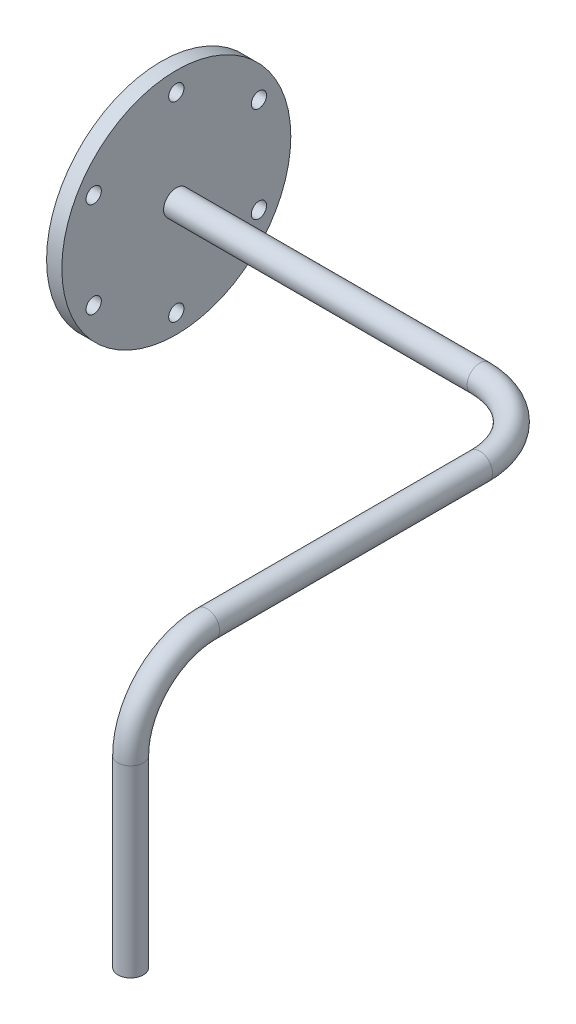
ISO-10303-21;
HEADER;
FILE_DESCRIPTION(('STEP AP214'),'2;1');
FILE_NAME('part.step','',(''),(''),'','','');
FILE_SCHEMA(('AUTOMOTIVE_DESIGN { 1 0 10303 214 1 1 1 1 }'));
ENDSEC;
DATA;
#1=APPLICATION_CONTEXT('core data for automotive mechanical design processes');
#2=APPLICATION_PROTOCOL_DEFINITION('international standard','automotive_design',2000,#1);
#3=PRODUCT_CONTEXT('',#1,'mechanical');
#4=PRODUCT('Part','Part','',(#3));
#5=PRODUCT_RELATED_PRODUCT_CATEGORY('part','',(#4));
#6=PRODUCT_DEFINITION_FORMATION('','',#4);
#7=PRODUCT_DEFINITION_CONTEXT('part definition',#1,'design');
#8=PRODUCT_DEFINITION('design','',#6,#7);
#9=PRODUCT_DEFINITION_SHAPE('','',#8);
#10=(LENGTH_UNIT() NAMED_UNIT(*) SI_UNIT(.MILLI.,.METRE.));
#11=(NAMED_UNIT(*) PLANE_ANGLE_UNIT() SI_UNIT($,.RADIAN.));
#12=(NAMED_UNIT(*) SI_UNIT($,.STERADIAN.) SOLID_ANGLE_UNIT());
#13=UNCERTAINTY_MEASURE_WITH_UNIT(LENGTH_MEASURE(1.E-05),#10,'distance_accuracy_value','');
#14=(GEOMETRIC_REPRESENTATION_CONTEXT(3) GLOBAL_UNCERTAINTY_ASSIGNED_CONTEXT((#13)) GLOBAL_UNIT_ASSIGNED_CONTEXT((#10,
#11,#12)) REPRESENTATION_CONTEXT('',''));
#15=CARTESIAN_POINT('',(0.,0.,0.));
#16=DIRECTION('',(0.,0.,1.));
#17=DIRECTION('',(1.,0.,0.));
#18=AXIS2_PLACEMENT_3D('',#15,#16,#17);
#19=CARTESIAN_POINT('',(-155.29,102.19,-167.24));
#20=DIRECTION('',(1.,0.,0.));
#21=DIRECTION('',(0.,1.,0.));
#22=AXIS2_PLACEMENT_3D('',#19,#20,#21);
#23=CYLINDRICAL_SURFACE('',#22,45.);
#24=CARTESIAN_POINT('',(-155.29,102.19,-167.24));
#25=DIRECTION('',(-1.,0.,0.));
#26=DIRECTION('',(0.,-1.,0.));
#27=AXIS2_PLACEMENT_3D('',#24,#25,#26);
#28=CIRCLE('',#27,45.);
#29=CARTESIAN_POINT('',(-155.29,57.19,-167.24));
#30=VERTEX_POINT('',#29);
#31=EDGE_CURVE('E12',#30,#30,#28,.T.);
#32=ORIENTED_EDGE('',*,*,#31,.F.);
#33=EDGE_LOOP('',(#32));
#34=FACE_BOUND('',#33,.T.);
#35=CARTESIAN_POINT('',(-149.29,102.19,-167.24));
#36=DIRECTION('',(-1.,0.,0.));
#37=DIRECTION('',(0.,-1.,0.));
#38=AXIS2_PLACEMENT_3D('',#35,#36,#37);
#39=CIRCLE('',#38,45.);
#40=CARTESIAN_POINT('',(-149.29,57.19,-167.24));
#41=VERTEX_POINT('',#40);
#42=EDGE_CURVE('E72',#41,#41,#39,.T.);
#43=ORIENTED_EDGE('',*,*,#42,.T.);
#44=EDGE_LOOP('',(#43));
#45=FACE_BOUND('',#44,.T.);
#46=ADVANCED_FACE('F65',(#34,#45),#23,.T.);
#47=CARTESIAN_POINT('',(-155.29,102.19,-167.24));
#48=DIRECTION('',(-1.,0.,0.));
#49=DIRECTION('',(0.,-1.,0.));
#50=AXIS2_PLACEMENT_3D('',#47,#48,#49);
#51=PLANE('',#50);
#52=CARTESIAN_POINT('',(-155.29,83.4400000000003,-134.764047358083));
#53=DIRECTION('',(-1.,0.,0.));
#54=DIRECTION('',(0.,0.499999999999992,-0.866025403784443));
#55=AXIS2_PLACEMENT_3D('',#52,#53,#54);
#56=CIRCLE('',#55,2.99999999999999);
#57=CARTESIAN_POINT('',(-155.29,84.9400000000003,-137.362123569437));
#58=VERTEX_POINT('',#57);
#59=EDGE_CURVE('E120',#58,#58,#56,.T.);
#60=ORIENTED_EDGE('',*,*,#59,.F.);
#61=EDGE_LOOP('',(#60));
#62=FACE_BOUND('',#61,.T.);
#63=CARTESIAN_POINT('',(-155.29,120.94,-134.764047358084));
#64=DIRECTION('',(-1.,0.,0.));
#65=DIRECTION('',(0.,-0.50000000000001,-0.866025403784433));
#66=AXIS2_PLACEMENT_3D('',#63,#64,#65);
#67=CIRCLE('',#66,2.99999999999999);
#68=CARTESIAN_POINT('',(-155.29,119.44,-137.362123569437));
#69=VERTEX_POINT('',#68);
#70=EDGE_CURVE('E123',#69,#69,#67,.T.);
#71=ORIENTED_EDGE('',*,*,#70,.F.);
#72=EDGE_LOOP('',(#71));
#73=FACE_BOUND('',#72,.T.);
#74=CARTESIAN_POINT('',(-155.29,83.4399999999998,-199.715952641916));
#75=DIRECTION('',(-1.,0.,0.));
#76=DIRECTION('',(0.,0.500000000000004,0.866025403784436));
#77=AXIS2_PLACEMENT_3D('',#74,#75,#76);
#78=CIRCLE('',#77,2.99999999999999);
#79=CARTESIAN_POINT('',(-155.29,84.9399999999999,-197.117876430563));
#80=VERTEX_POINT('',#79);
#81=EDGE_CURVE('E114',#80,#80,#78,.T.);
#82=ORIENTED_EDGE('',*,*,#81,.F.);
#83=EDGE_LOOP('',(#82));
#84=FACE_BOUND('',#83,.T.);
#85=CARTESIAN_POINT('',(-155.29,64.69,-167.24));
#86=DIRECTION('',(-1.,0.,0.));
#87=DIRECTION('',(0.,1.,0.));
#88=AXIS2_PLACEMENT_3D('',#85,#86,#87);
#89=CIRCLE('',#88,2.99999999999999);
#90=CARTESIAN_POINT('',(-155.29,67.69,-167.24));
#91=VERTEX_POINT('',#90);
#92=EDGE_CURVE('E117',#91,#91,#89,.T.);
#93=ORIENTED_EDGE('',*,*,#92,.F.);
#94=EDGE_LOOP('',(#93));
#95=FACE_BOUND('',#94,.T.);
#96=CARTESIAN_POINT('',(-155.29,120.94,-199.715952641916));
#97=DIRECTION('',(-1.,0.,0.));
#98=DIRECTION('',(0.,-0.499999999999998,0.86602540378444));
#99=AXIS2_PLACEMENT_3D('',#96,#97,#98);
#100=CIRCLE('',#99,2.99999999999999);
#101=CARTESIAN_POINT('',(-155.29,119.44,-197.117876430563));
#102=VERTEX_POINT('',#101);
#103=EDGE_CURVE('E93',#102,#102,#100,.T.);
#104=ORIENTED_EDGE('',*,*,#103,.F.);
#105=EDGE_LOOP('',(#104));
#106=FACE_BOUND('',#105,.T.);
#107=CARTESIAN_POINT('',(-155.29,139.69,-167.24));
#108=DIRECTION('',(-1.,0.,0.));
#109=DIRECTION('',(0.,-1.,0.));
#110=AXIS2_PLACEMENT_3D('',#107,#108,#109);
#111=CIRCLE('',#110,2.99999999999999);
#112=CARTESIAN_POINT('',(-155.29,136.69,-167.24));
#113=VERTEX_POINT('',#112);
#114=EDGE_CURVE('E86',#113,#113,#111,.T.);
#115=ORIENTED_EDGE('',*,*,#114,.F.);
#116=EDGE_LOOP('',(#115));
#117=FACE_BOUND('',#116,.T.);
#118=CARTESIAN_POINT('',(-155.29,102.19,-167.24));
#119=DIRECTION('',(-1.,0.,0.));
#120=DIRECTION('',(0.,-1.,0.));
#121=AXIS2_PLACEMENT_3D('',#118,#119,#120);
#122=CIRCLE('',#121,2.99999999999999);
#123=CARTESIAN_POINT('',(-155.29,99.19,-167.24));
#124=VERTEX_POINT('',#123);
#125=EDGE_CURVE('E80',#124,#124,#122,.T.);
#126=ORIENTED_EDGE('',*,*,#125,.F.);
#127=EDGE_LOOP('',(#126));
#128=FACE_BOUND('',#127,.T.);
#129=ORIENTED_EDGE('',*,*,#31,.T.);
#130=EDGE_LOOP('',(#129));
#131=FACE_BOUND('',#130,.T.);
#132=ADVANCED_FACE('F130',(#62,#73,#84,#95,#106,#117,#128,#131),#51,.T.);
#133=CARTESIAN_POINT('',(-149.29,102.19,-167.24));
#134=DIRECTION('',(-1.,0.,0.));
#135=DIRECTION('',(0.,-1.,0.));
#136=AXIS2_PLACEMENT_3D('',#133,#134,#135);
#137=PLANE('',#136);
#138=CARTESIAN_POINT('',(-149.29,83.4400000000003,-134.764047358083));
#139=DIRECTION('',(-1.,0.,0.));
#140=DIRECTION('',(0.,-1.,0.));
#141=AXIS2_PLACEMENT_3D('',#138,#139,#140);
#142=CIRCLE('',#141,2.99999999999999);
#143=CARTESIAN_POINT('',(-149.29,80.4400000000003,-134.764047358083));
#144=VERTEX_POINT('',#143);
#145=EDGE_CURVE('E68',#144,#144,#142,.T.);
#146=ORIENTED_EDGE('',*,*,#145,.T.);
#147=EDGE_LOOP('',(#146));
#148=FACE_BOUND('',#147,.T.);
#149=CARTESIAN_POINT('',(-149.29,120.94,-134.764047358084));
#150=DIRECTION('',(-1.,0.,0.));
#151=DIRECTION('',(0.,-1.,0.));
#152=AXIS2_PLACEMENT_3D('',#149,#150,#151);
#153=CIRCLE('',#152,2.99999999999999);
#154=CARTESIAN_POINT('',(-149.29,117.94,-134.764047358084));
#155=VERTEX_POINT('',#154);
#156=EDGE_CURVE('E98',#155,#155,#153,.T.);
#157=ORIENTED_EDGE('',*,*,#156,.T.);
#158=EDGE_LOOP('',(#157));
#159=FACE_BOUND('',#158,.T.);
#160=CARTESIAN_POINT('',(-149.29,83.4399999999998,-199.715952641916));
#161=DIRECTION('',(-1.,0.,0.));
#162=DIRECTION('',(0.,-1.,0.));
#163=AXIS2_PLACEMENT_3D('',#160,#161,#162);
#164=CIRCLE('',#163,2.99999999999999);
#165=CARTESIAN_POINT('',(-149.29,80.4399999999999,-199.715952641916));
#166=VERTEX_POINT('',#165);
#167=EDGE_CURVE('E96',#166,#166,#164,.T.);
#168=ORIENTED_EDGE('',*,*,#167,.T.);
#169=EDGE_LOOP('',(#168));
#170=FACE_BOUND('',#169,.T.);
#171=CARTESIAN_POINT('',(-149.29,64.69,-167.24));
#172=DIRECTION('',(-1.,0.,0.));
#173=DIRECTION('',(0.,-1.,0.));
#174=AXIS2_PLACEMENT_3D('',#171,#172,#173);
#175=CIRCLE('',#174,2.99999999999999);
#176=CARTESIAN_POINT('',(-149.29,61.69,-167.24));
#177=VERTEX_POINT('',#176);
#178=EDGE_CURVE('E92',#177,#177,#175,.T.);
#179=ORIENTED_EDGE('',*,*,#178,.T.);
#180=EDGE_LOOP('',(#179));
#181=FACE_BOUND('',#180,.T.);
#182=CARTESIAN_POINT('',(-149.29,120.94,-199.715952641916));
#183=DIRECTION('',(-1.,0.,0.));
#184=DIRECTION('',(0.,-1.,0.));
#185=AXIS2_PLACEMENT_3D('',#182,#183,#184);
#186=CIRCLE('',#185,2.99999999999999);
#187=CARTESIAN_POINT('',(-149.29,117.94,-199.715952641916));
#188=VERTEX_POINT('',#187);
#189=EDGE_CURVE('E89',#188,#188,#186,.T.);
#190=ORIENTED_EDGE('',*,*,#189,.T.);
#191=EDGE_LOOP('',(#190));
#192=FACE_BOUND('',#191,.T.);
#193=CARTESIAN_POINT('',(-149.29,139.69,-167.24));
#194=DIRECTION('',(-1.,0.,0.));
#195=DIRECTION('',(0.,-1.,0.));
#196=AXIS2_PLACEMENT_3D('',#193,#194,#195);
#197=CIRCLE('',#196,2.99999999999999);
#198=CARTESIAN_POINT('',(-149.29,136.69,-167.24));
#199=VERTEX_POINT('',#198);
#200=EDGE_CURVE('E77',#199,#199,#197,.T.);
#201=ORIENTED_EDGE('',*,*,#200,.T.);
#202=EDGE_LOOP('',(#201));
#203=FACE_BOUND('',#202,.T.);
#204=CARTESIAN_POINT('',(-149.29,102.19,-167.24));
#205=DIRECTION('',(-1.,0.,0.));
#206=DIRECTION('',(0.,-1.,0.));
#207=AXIS2_PLACEMENT_3D('',#204,#205,#206);
#208=CIRCLE('',#207,2.99999999999999);
#209=CARTESIAN_POINT('',(-149.29,99.19,-167.24));
#210=VERTEX_POINT('',#209);
#211=EDGE_CURVE('E83',#210,#210,#208,.T.);
#212=ORIENTED_EDGE('',*,*,#211,.T.);
#213=EDGE_LOOP('',(#212));
#214=FACE_BOUND('',#213,.T.);
#215=ORIENTED_EDGE('',*,*,#42,.F.);
#216=EDGE_LOOP('',(#215));
#217=FACE_BOUND('',#216,.T.);
#218=ADVANCED_FACE('F133',(#148,#159,#170,#181,#192,#203,#214,#217),#137,.F.);
#219=CARTESIAN_POINT('',(-147.29,102.19,-167.24));
#220=DIRECTION('',(-1.,0.,0.));
#221=DIRECTION('',(0.,-1.,0.));
#222=AXIS2_PLACEMENT_3D('',#219,#220,#221);
#223=CYLINDRICAL_SURFACE('',#222,2.99999999999999);
#224=ORIENTED_EDGE('',*,*,#125,.T.);
#225=EDGE_LOOP('',(#224));
#226=FACE_BOUND('',#225,.T.);
#227=ORIENTED_EDGE('',*,*,#211,.F.);
#228=EDGE_LOOP('',(#227));
#229=FACE_BOUND('',#228,.T.);
#230=ADVANCED_FACE('F154',(#226,#229),#223,.F.);
#231=CARTESIAN_POINT('',(-147.29,139.69,-167.24));
#232=DIRECTION('',(-1.,0.,0.));
#233=DIRECTION('',(0.,-1.,0.));
#234=AXIS2_PLACEMENT_3D('',#231,#232,#233);
#235=CYLINDRICAL_SURFACE('',#234,2.99999999999999);
#236=ORIENTED_EDGE('',*,*,#114,.T.);
#237=EDGE_LOOP('',(#236));
#238=FACE_BOUND('',#237,.T.);
#239=ORIENTED_EDGE('',*,*,#200,.F.);
#240=EDGE_LOOP('',(#239));
#241=FACE_BOUND('',#240,.T.);
#242=ADVANCED_FACE('F148',(#238,#241),#235,.F.);
#243=CARTESIAN_POINT('',(-147.29,120.94,-199.715952641916));
#244=DIRECTION('',(-1.,0.,0.));
#245=DIRECTION('',(0.,0.,1.));
#246=AXIS2_PLACEMENT_3D('',#243,#244,#245);
#247=CYLINDRICAL_SURFACE('',#246,2.99999999999999);
#248=ORIENTED_EDGE('',*,*,#103,.T.);
#249=EDGE_LOOP('',(#248));
#250=FACE_BOUND('',#249,.T.);
#251=ORIENTED_EDGE('',*,*,#189,.F.);
#252=EDGE_LOOP('',(#251));
#253=FACE_BOUND('',#252,.T.);
#254=ADVANCED_FACE('F144',(#250,#253),#247,.F.);
#255=CARTESIAN_POINT('',(-147.29,64.69,-167.24));
#256=DIRECTION('',(-1.,0.,0.));
#257=DIRECTION('',(0.,-1.,0.));
#258=AXIS2_PLACEMENT_3D('',#255,#256,#257);
#259=CYLINDRICAL_SURFACE('',#258,2.99999999999999);
#260=ORIENTED_EDGE('',*,*,#92,.T.);
#261=EDGE_LOOP('',(#260));
#262=FACE_BOUND('',#261,.T.);
#263=ORIENTED_EDGE('',*,*,#178,.F.);
#264=EDGE_LOOP('',(#263));
#265=FACE_BOUND('',#264,.T.);
#266=ADVANCED_FACE('F147',(#262,#265),#259,.F.);
#267=CARTESIAN_POINT('',(-147.29,83.4399999999998,-199.715952641916));
#268=DIRECTION('',(-1.,0.,0.));
#269=DIRECTION('',(0.,0.,1.));
#270=AXIS2_PLACEMENT_3D('',#267,#268,#269);
#271=CYLINDRICAL_SURFACE('',#270,2.99999999999999);
#272=ORIENTED_EDGE('',*,*,#81,.T.);
#273=EDGE_LOOP('',(#272));
#274=FACE_BOUND('',#273,.T.);
#275=ORIENTED_EDGE('',*,*,#167,.F.);
#276=EDGE_LOOP('',(#275));
#277=FACE_BOUND('',#276,.T.);
#278=ADVANCED_FACE('F201',(#274,#277),#271,.F.);
#279=CARTESIAN_POINT('',(-147.29,120.94,-134.764047358084));
#280=DIRECTION('',(-1.,0.,0.));
#281=DIRECTION('',(0.,0.,1.));
#282=AXIS2_PLACEMENT_3D('',#279,#280,#281);
#283=CYLINDRICAL_SURFACE('',#282,2.99999999999999);
#284=ORIENTED_EDGE('',*,*,#70,.T.);
#285=EDGE_LOOP('',(#284));
#286=FACE_BOUND('',#285,.T.);
#287=ORIENTED_EDGE('',*,*,#156,.F.);
#288=EDGE_LOOP('',(#287));
#289=FACE_BOUND('',#288,.T.);
#290=ADVANCED_FACE('F127',(#286,#289),#283,.F.);
#291=CARTESIAN_POINT('',(-147.29,83.4400000000003,-134.764047358083));
#292=DIRECTION('',(-1.,0.,0.));
#293=DIRECTION('',(0.,0.,1.));
#294=AXIS2_PLACEMENT_3D('',#291,#292,#293);
#295=CYLINDRICAL_SURFACE('',#294,2.99999999999999);
#296=ORIENTED_EDGE('',*,*,#59,.T.);
#297=EDGE_LOOP('',(#296));
#298=FACE_BOUND('',#297,.T.);
#299=ORIENTED_EDGE('',*,*,#145,.F.);
#300=EDGE_LOOP('',(#299));
#301=FACE_BOUND('',#300,.T.);
#302=ADVANCED_FACE('F218',(#298,#301),#295,.F.);
#303=CLOSED_SHELL('',(#46,#132,#218,#230,#242,#254,#266,#278,#290,#302));
#304=MANIFOLD_SOLID_BREP('B2',#303);
#305=CARTESIAN_POINT('',(0.,0.,0.));
#306=DIRECTION('',(0.,-1.,0.));
#307=DIRECTION('',(1.,0.,0.));
#308=AXIS2_PLACEMENT_3D('',#305,#306,#307);
#309=PLANE('',#308);
#310=CARTESIAN_POINT('',(0.,0.,0.));
#311=DIRECTION('',(0.,-1.,0.));
#312=DIRECTION('',(0.,0.,-1.));
#313=AXIS2_PLACEMENT_3D('',#310,#311,#312);
#314=CIRCLE('',#313,3.);
#315=CARTESIAN_POINT('',(0.,0.,-3.));
#316=VERTEX_POINT('',#315);
#317=EDGE_CURVE('E286',#316,#316,#314,.T.);
#318=ORIENTED_EDGE('',*,*,#317,.F.);
#319=EDGE_LOOP('',(#318));
#320=FACE_BOUND('',#319,.T.);
#321=CARTESIAN_POINT('',(0.,0.,0.));
#322=DIRECTION('',(0.,-1.,0.));
#323=DIRECTION('',(1.,0.,0.));
#324=AXIS2_PLACEMENT_3D('',#321,#322,#323);
#325=CIRCLE('',#324,5.);
#326=CARTESIAN_POINT('',(5.,0.,0.));
#327=VERTEX_POINT('',#326);
#328=EDGE_CURVE('E263',#327,#327,#325,.T.);
#329=ORIENTED_EDGE('',*,*,#328,.T.);
#330=EDGE_LOOP('',(#329));
#331=FACE_BOUND('',#330,.T.);
#332=ADVANCED_FACE('F253',(#320,#331),#309,.T.);
#333=CARTESIAN_POINT('',(0.,0.,0.));
#334=DIRECTION('',(0.,1.,0.));
#335=DIRECTION('',(0.,0.,1.));
#336=AXIS2_PLACEMENT_3D('',#333,#334,#335);
#337=CYLINDRICAL_SURFACE('',#336,5.);
#338=CARTESIAN_POINT('',(0.,72.19,0.));
#339=DIRECTION('',(0.,-1.,0.));
#340=DIRECTION('',(1.,0.,0.));
#341=AXIS2_PLACEMENT_3D('',#338,#339,#340);
#342=CIRCLE('',#341,5.);
#343=CARTESIAN_POINT('',(0.,72.19,5.));
#344=VERTEX_POINT('',#343);
#345=EDGE_CURVE('E259',#344,#344,#342,.T.);
#346=ORIENTED_EDGE('',*,*,#345,.T.);
#347=EDGE_LOOP('',(#346));
#348=FACE_BOUND('',#347,.T.);
#349=ORIENTED_EDGE('',*,*,#328,.F.);
#350=EDGE_LOOP('',(#349));
#351=FACE_BOUND('',#350,.T.);
#352=ADVANCED_FACE('F301',(#348,#351),#337,.T.);
#353=CARTESIAN_POINT('',(0.,72.19,-30.));
#354=DIRECTION('',(-1.,0.,0.));
#355=DIRECTION('',(0.,0.,1.));
#356=AXIS2_PLACEMENT_3D('',#353,#354,#355);
#357=TOROIDAL_SURFACE('',#356,30.,5.);
#358=CARTESIAN_POINT('',(0.,102.19,-30.));
#359=DIRECTION('',(0.,0.,1.));
#360=DIRECTION('',(1.,0.,0.));
#361=AXIS2_PLACEMENT_3D('',#358,#359,#360);
#362=CIRCLE('',#361,5.);
#363=CARTESIAN_POINT('',(0.,107.19,-30.));
#364=VERTEX_POINT('',#363);
#365=EDGE_CURVE('E64',#364,#364,#362,.T.);
#366=CARTESIAN_POINT('',(0.,72.19,-30.));
#367=DIRECTION('',(-1.,0.,0.));
#368=DIRECTION('',(0.,0.,1.));
#369=AXIS2_PLACEMENT_3D('',#366,#367,#368);
#370=CIRCLE('',#369,35.);
#371=EDGE_CURVE('',#344,#364,#370,.T.);
#372=ORIENTED_EDGE('',*,*,#345,.F.);
#373=ORIENTED_EDGE('',*,*,#365,.T.);
#374=ORIENTED_EDGE('',*,*,#371,.T.);
#375=ORIENTED_EDGE('',*,*,#371,.F.);
#376=EDGE_LOOP('',(#372,#374,#373,#375));
#377=FACE_BOUND('',#376,.T.);
#378=ADVANCED_FACE('F306',(#377),#357,.T.);
#379=CARTESIAN_POINT('',(0.,102.19,-30.));
#380=DIRECTION('',(0.,0.,-1.));
#381=DIRECTION('',(0.,1.,0.));
#382=AXIS2_PLACEMENT_3D('',#379,#380,#381);
#383=CYLINDRICAL_SURFACE('',#382,5.);
#384=CARTESIAN_POINT('',(0.,102.19,-137.24));
#385=DIRECTION('',(0.,0.,1.));
#386=DIRECTION('',(1.,0.,0.));
#387=AXIS2_PLACEMENT_3D('',#384,#385,#386);
#388=CIRCLE('',#387,5.);
#389=CARTESIAN_POINT('',(5.,102.19,-137.24));
#390=VERTEX_POINT('',#389);
#391=EDGE_CURVE('E267',#390,#390,#388,.T.);
#392=ORIENTED_EDGE('',*,*,#391,.T.);
#393=EDGE_LOOP('',(#392));
#394=FACE_BOUND('',#393,.T.);
#395=ORIENTED_EDGE('',*,*,#365,.F.);
#396=EDGE_LOOP('',(#395));
#397=FACE_BOUND('',#396,.T.);
#398=ADVANCED_FACE('F311',(#394,#397),#383,.T.);
#399=CARTESIAN_POINT('',(-30.,102.19,-137.24));
#400=DIRECTION('',(0.,-1.,0.));
#401=DIRECTION('',(0.,0.,-1.));
#402=AXIS2_PLACEMENT_3D('',#399,#400,#401);
#403=TOROIDAL_SURFACE('',#402,30.,5.);
#404=CARTESIAN_POINT('',(-29.9999999999999,102.19,-167.24));
#405=DIRECTION('',(-1.,0.,0.));
#406=DIRECTION('',(0.,-1.,0.));
#407=AXIS2_PLACEMENT_3D('',#404,#405,#406);
#408=CIRCLE('',#407,5.00000000000002);
#409=CARTESIAN_POINT('',(-29.9999999999999,102.19,-172.24));
#410=VERTEX_POINT('',#409);
#411=EDGE_CURVE('E273',#410,#410,#408,.T.);
#412=CARTESIAN_POINT('',(-30.,102.19,-137.24));
#413=DIRECTION('',(0.,-1.,0.));
#414=DIRECTION('',(0.,0.,-1.));
#415=AXIS2_PLACEMENT_3D('',#412,#413,#414);
#416=CIRCLE('',#415,35.);
#417=EDGE_CURVE('',#410,#390,#416,.T.);
#418=ORIENTED_EDGE('',*,*,#411,.F.);
#419=ORIENTED_EDGE('',*,*,#391,.F.);
#420=ORIENTED_EDGE('',*,*,#417,.T.);
#421=ORIENTED_EDGE('',*,*,#417,.F.);
#422=EDGE_LOOP('',(#418,#420,#419,#421));
#423=FACE_BOUND('',#422,.T.);
#424=ADVANCED_FACE('F302',(#423),#403,.T.);
#425=CARTESIAN_POINT('',(-149.29,102.19,-167.24));
#426=DIRECTION('',(1.,0.,0.));
#427=DIRECTION('',(0.,1.,0.));
#428=AXIS2_PLACEMENT_3D('',#425,#426,#427);
#429=CYLINDRICAL_SURFACE('',#428,5.00000000000002);
#430=CARTESIAN_POINT('',(-149.29,102.19,-167.24));
#431=DIRECTION('',(-1.,0.,0.));
#432=DIRECTION('',(0.,-1.,0.));
#433=AXIS2_PLACEMENT_3D('',#430,#431,#432);
#434=CIRCLE('',#433,5.00000000000002);
#435=CARTESIAN_POINT('',(-149.29,97.19,-167.24));
#436=VERTEX_POINT('',#435);
#437=EDGE_CURVE('E272',#436,#436,#434,.T.);
#438=ORIENTED_EDGE('',*,*,#437,.F.);
#439=EDGE_LOOP('',(#438));
#440=FACE_BOUND('',#439,.T.);
#441=ORIENTED_EDGE('',*,*,#411,.T.);
#442=EDGE_LOOP('',(#441));
#443=FACE_BOUND('',#442,.T.);
#444=ADVANCED_FACE('F319',(#440,#443),#429,.T.);
#445=CARTESIAN_POINT('',(-149.29,102.19,-167.24));
#446=DIRECTION('',(-1.,0.,0.));
#447=DIRECTION('',(0.,-1.,0.));
#448=AXIS2_PLACEMENT_3D('',#445,#446,#447);
#449=PLANE('',#448);
#450=CARTESIAN_POINT('',(-149.29,102.19,-167.24));
#451=DIRECTION('',(-1.,0.,0.));
#452=DIRECTION('',(0.,-1.,0.));
#453=AXIS2_PLACEMENT_3D('',#450,#451,#452);
#454=CIRCLE('',#453,3.00000000000002);
#455=CARTESIAN_POINT('',(-149.29,99.19,-167.24));
#456=VERTEX_POINT('',#455);
#457=EDGE_CURVE('E279',#456,#456,#454,.T.);
#458=ORIENTED_EDGE('',*,*,#457,.F.);
#459=EDGE_LOOP('',(#458));
#460=FACE_BOUND('',#459,.T.);
#461=ORIENTED_EDGE('',*,*,#437,.T.);
#462=EDGE_LOOP('',(#461));
#463=FACE_BOUND('',#462,.T.);
#464=ADVANCED_FACE('F327',(#460,#463),#449,.T.);
#465=CARTESIAN_POINT('',(0.,0.,0.));
#466=DIRECTION('',(0.,1.,0.));
#467=DIRECTION('',(0.,0.,1.));
#468=AXIS2_PLACEMENT_3D('',#465,#466,#467);
#469=CYLINDRICAL_SURFACE('',#468,3.);
#470=CARTESIAN_POINT('',(0.,72.19,0.));
#471=DIRECTION('',(0.,1.,0.));
#472=DIRECTION('',(0.,0.,1.));
#473=AXIS2_PLACEMENT_3D('',#470,#471,#472);
#474=CIRCLE('',#473,3.);
#475=CARTESIAN_POINT('',(0.,72.19,3.));
#476=VERTEX_POINT('',#475);
#477=EDGE_CURVE('E289',#476,#476,#474,.F.);
#478=ORIENTED_EDGE('',*,*,#477,.F.);
#479=EDGE_LOOP('',(#478));
#480=FACE_BOUND('',#479,.T.);
#481=ORIENTED_EDGE('',*,*,#317,.T.);
#482=EDGE_LOOP('',(#481));
#483=FACE_BOUND('',#482,.T.);
#484=ADVANCED_FACE('F297',(#480,#483),#469,.F.);
#485=CARTESIAN_POINT('',(0.,72.19,-30.));
#486=DIRECTION('',(-1.,0.,0.));
#487=DIRECTION('',(0.,0.,1.));
#488=AXIS2_PLACEMENT_3D('',#485,#486,#487);
#489=TOROIDAL_SURFACE('',#488,30.,3.);
#490=CARTESIAN_POINT('',(0.,102.19,-30.));
#491=DIRECTION('',(0.,0.,1.));
#492=DIRECTION('',(0.,-1.,0.));
#493=AXIS2_PLACEMENT_3D('',#490,#491,#492);
#494=CIRCLE('',#493,3.);
#495=CARTESIAN_POINT('',(0.,105.19,-30.));
#496=VERTEX_POINT('',#495);
#497=EDGE_CURVE('E276',#496,#496,#494,.T.);
#498=CARTESIAN_POINT('',(0.,72.19,-30.));
#499=DIRECTION('',(-1.,0.,0.));
#500=DIRECTION('',(0.,0.,1.));
#501=AXIS2_PLACEMENT_3D('',#498,#499,#500);
#502=CIRCLE('',#501,33.);
#503=EDGE_CURVE('',#476,#496,#502,.T.);
#504=ORIENTED_EDGE('',*,*,#477,.T.);
#505=ORIENTED_EDGE('',*,*,#497,.F.);
#506=ORIENTED_EDGE('',*,*,#503,.T.);
#507=ORIENTED_EDGE('',*,*,#503,.F.);
#508=EDGE_LOOP('',(#504,#506,#505,#507));
#509=FACE_BOUND('',#508,.T.);
#510=ADVANCED_FACE('F348',(#509),#489,.F.);
#511=CARTESIAN_POINT('',(0.,102.19,-30.));
#512=DIRECTION('',(0.,0.,-1.));
#513=DIRECTION('',(0.,1.,0.));
#514=AXIS2_PLACEMENT_3D('',#511,#512,#513);
#515=CYLINDRICAL_SURFACE('',#514,3.);
#516=CARTESIAN_POINT('',(0.,102.19,-137.24));
#517=DIRECTION('',(0.,0.,-1.));
#518=DIRECTION('',(0.,1.,0.));
#519=AXIS2_PLACEMENT_3D('',#516,#517,#518);
#520=CIRCLE('',#519,3.);
#521=CARTESIAN_POINT('',(3.,102.19,-137.24));
#522=VERTEX_POINT('',#521);
#523=EDGE_CURVE('E282',#522,#522,#520,.F.);
#524=ORIENTED_EDGE('',*,*,#523,.F.);
#525=EDGE_LOOP('',(#524));
#526=FACE_BOUND('',#525,.T.);
#527=ORIENTED_EDGE('',*,*,#497,.T.);
#528=EDGE_LOOP('',(#527));
#529=FACE_BOUND('',#528,.T.);
#530=ADVANCED_FACE('F335',(#526,#529),#515,.F.);
#531=CARTESIAN_POINT('',(-30.,102.19,-137.24));
#532=DIRECTION('',(0.,-1.,0.));
#533=DIRECTION('',(0.,0.,-1.));
#534=AXIS2_PLACEMENT_3D('',#531,#532,#533);
#535=TOROIDAL_SURFACE('',#534,30.,3.);
#536=CARTESIAN_POINT('',(-30.,102.19,-167.24));
#537=DIRECTION('',(1.,0.,0.));
#538=DIRECTION('',(0.,1.,0.));
#539=AXIS2_PLACEMENT_3D('',#536,#537,#538);
#540=CIRCLE('',#539,3.00000000000002);
#541=CARTESIAN_POINT('',(-30.,102.19,-170.24));
#542=VERTEX_POINT('',#541);
#543=EDGE_CURVE('E283',#542,#542,#540,.F.);
#544=CARTESIAN_POINT('',(-30.,102.19,-137.24));
#545=DIRECTION('',(0.,-1.,0.));
#546=DIRECTION('',(0.,0.,-1.));
#547=AXIS2_PLACEMENT_3D('',#544,#545,#546);
#548=CIRCLE('',#547,33.);
#549=EDGE_CURVE('',#542,#522,#548,.T.);
#550=ORIENTED_EDGE('',*,*,#543,.T.);
#551=ORIENTED_EDGE('',*,*,#523,.T.);
#552=ORIENTED_EDGE('',*,*,#549,.T.);
#553=ORIENTED_EDGE('',*,*,#549,.F.);
#554=EDGE_LOOP('',(#550,#552,#551,#553));
#555=FACE_BOUND('',#554,.T.);
#556=ADVANCED_FACE('F341',(#555),#535,.F.);
#557=CARTESIAN_POINT('',(-149.29,102.19,-167.24));
#558=DIRECTION('',(1.,0.,0.));
#559=DIRECTION('',(0.,1.,0.));
#560=AXIS2_PLACEMENT_3D('',#557,#558,#559);
#561=CYLINDRICAL_SURFACE('',#560,3.00000000000002);
#562=ORIENTED_EDGE('',*,*,#457,.T.);
#563=EDGE_LOOP('',(#562));
#564=FACE_BOUND('',#563,.T.);
#565=ORIENTED_EDGE('',*,*,#543,.F.);
#566=EDGE_LOOP('',(#565));
#567=FACE_BOUND('',#566,.T.);
#568=ADVANCED_FACE('F338',(#564,#567),#561,.F.);
#569=CLOSED_SHELL('',(#332,#352,#378,#398,#424,#444,#464,#484,#510,#530,#556,#568));
#570=MANIFOLD_SOLID_BREP('B7',#569);
#571=ADVANCED_BREP_SHAPE_REPRESENTATION('',(#18,#304,#570),#14);
#572=SHAPE_DEFINITION_REPRESENTATION(#9,#571);
ENDSEC;
END-ISO-10303-21;
